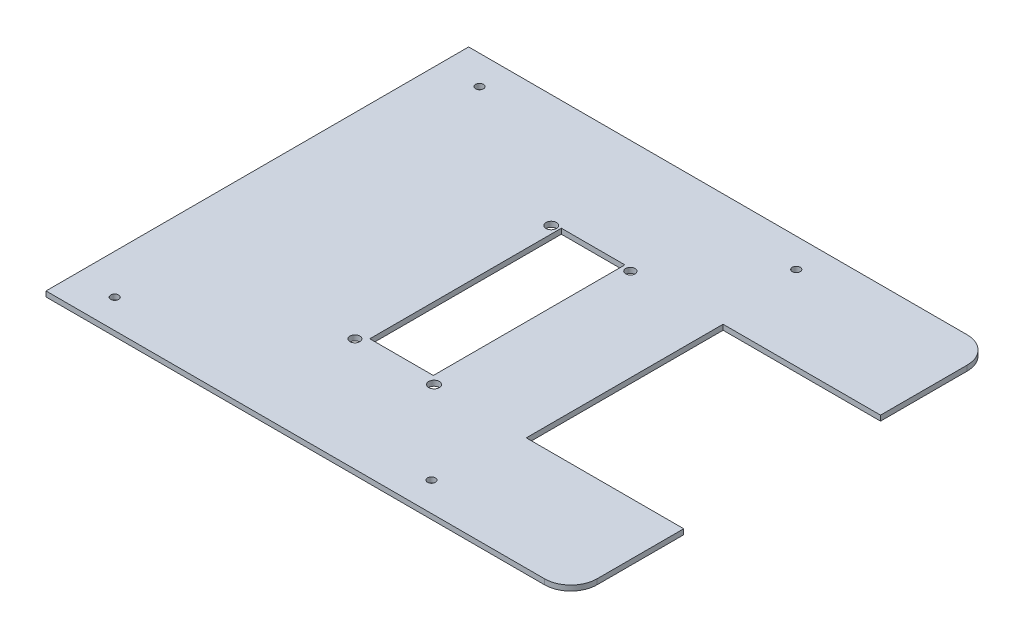
ISO-10303-21;
HEADER;
FILE_DESCRIPTION(('STEP AP214'),'2;1');
FILE_NAME('part.step','',(''),(''),'','','');
FILE_SCHEMA(('AUTOMOTIVE_DESIGN { 1 0 10303 214 1 1 1 1 }'));
ENDSEC;
DATA;
#1=APPLICATION_CONTEXT('core data for automotive mechanical design processes');
#2=APPLICATION_PROTOCOL_DEFINITION('international standard','automotive_design',2000,#1);
#3=PRODUCT_CONTEXT('',#1,'mechanical');
#4=PRODUCT('Part','Part','',(#3));
#5=PRODUCT_RELATED_PRODUCT_CATEGORY('part','',(#4));
#6=PRODUCT_DEFINITION_FORMATION('','',#4);
#7=PRODUCT_DEFINITION_CONTEXT('part definition',#1,'design');
#8=PRODUCT_DEFINITION('design','',#6,#7);
#9=PRODUCT_DEFINITION_SHAPE('','',#8);
#10=(LENGTH_UNIT() NAMED_UNIT(*) SI_UNIT(.MILLI.,.METRE.));
#11=(NAMED_UNIT(*) PLANE_ANGLE_UNIT() SI_UNIT($,.RADIAN.));
#12=(NAMED_UNIT(*) SI_UNIT($,.STERADIAN.) SOLID_ANGLE_UNIT());
#13=UNCERTAINTY_MEASURE_WITH_UNIT(LENGTH_MEASURE(1.E-05),#10,'distance_accuracy_value','');
#14=(GEOMETRIC_REPRESENTATION_CONTEXT(3) GLOBAL_UNCERTAINTY_ASSIGNED_CONTEXT((#13)) GLOBAL_UNIT_ASSIGNED_CONTEXT((#10,
#11,#12)) REPRESENTATION_CONTEXT('',''));
#15=CARTESIAN_POINT('',(0.,0.,0.));
#16=DIRECTION('',(0.,0.,1.));
#17=DIRECTION('',(1.,0.,0.));
#18=AXIS2_PLACEMENT_3D('',#15,#16,#17);
#19=CARTESIAN_POINT('',(-137.5,2.,80.53));
#20=DIRECTION('',(0.,0.,-1.));
#21=DIRECTION('',(-1.,0.,0.));
#22=AXIS2_PLACEMENT_3D('',#19,#20,#21);
#23=PLANE('',#22);
#24=DIRECTION('',(1.,0.,0.));
#25=VECTOR('',#24,1.);
#26=CARTESIAN_POINT('',(-137.5,0.,80.53));
#27=LINE('',#26,#25);
#28=CARTESIAN_POINT('',(-137.5,0.,80.53));
#29=VERTEX_POINT('',#28);
#30=CARTESIAN_POINT('',(52.5,0.,80.53));
#31=VERTEX_POINT('',#30);
#32=EDGE_CURVE('E207',#29,#31,#27,.T.);
#33=ORIENTED_EDGE('',*,*,#32,.T.);
#34=DIRECTION('',(0.,-1.,0.));
#35=VECTOR('',#34,1.);
#36=CARTESIAN_POINT('',(52.5,2.,80.53));
#37=LINE('',#36,#35);
#38=CARTESIAN_POINT('',(52.5,2.,80.53));
#39=VERTEX_POINT('',#38);
#40=EDGE_CURVE('E11',#31,#39,#37,.F.);
#41=ORIENTED_EDGE('',*,*,#40,.T.);
#42=DIRECTION('',(1.,0.,0.));
#43=VECTOR('',#42,1.);
#44=CARTESIAN_POINT('',(-137.5,2.,80.53));
#45=LINE('',#44,#43);
#46=CARTESIAN_POINT('',(-137.5,2.,80.53));
#47=VERTEX_POINT('',#46);
#48=EDGE_CURVE('E208',#47,#39,#45,.T.);
#49=ORIENTED_EDGE('',*,*,#48,.F.);
#50=DIRECTION('',(0.,-1.,0.));
#51=VECTOR('',#50,1.);
#52=CARTESIAN_POINT('',(-137.5,2.,80.53));
#53=LINE('',#52,#51);
#54=EDGE_CURVE('E226',#47,#29,#53,.T.);
#55=ORIENTED_EDGE('',*,*,#54,.T.);
#56=EDGE_LOOP('',(#33,#41,#49,#55));
#57=FACE_BOUND('',#56,.T.);
#58=ADVANCED_FACE('F34',(#57),#23,.F.);
#59=CARTESIAN_POINT('',(62.5,2.,37.5));
#60=DIRECTION('',(-1.,0.,0.));
#61=DIRECTION('',(0.,0.,1.));
#62=AXIS2_PLACEMENT_3D('',#59,#60,#61);
#63=PLANE('',#62);
#64=DIRECTION('',(0.,0.,-1.));
#65=VECTOR('',#64,1.);
#66=CARTESIAN_POINT('',(62.5,2.,37.5));
#67=LINE('',#66,#65);
#68=CARTESIAN_POINT('',(62.5,2.,70.53));
#69=VERTEX_POINT('',#68);
#70=CARTESIAN_POINT('',(62.5,2.,37.5));
#71=VERTEX_POINT('',#70);
#72=EDGE_CURVE('E210',#69,#71,#67,.T.);
#73=ORIENTED_EDGE('',*,*,#72,.F.);
#74=DIRECTION('',(0.,-1.,0.));
#75=VECTOR('',#74,1.);
#76=CARTESIAN_POINT('',(62.5,2.,70.53));
#77=LINE('',#76,#75);
#78=CARTESIAN_POINT('',(62.5,0.,70.53));
#79=VERTEX_POINT('',#78);
#80=EDGE_CURVE('E42',#69,#79,#77,.T.);
#81=ORIENTED_EDGE('',*,*,#80,.T.);
#82=DIRECTION('',(0.,0.,-1.));
#83=VECTOR('',#82,1.);
#84=CARTESIAN_POINT('',(62.5,0.,37.5));
#85=LINE('',#84,#83);
#86=CARTESIAN_POINT('',(62.5,0.,37.5));
#87=VERTEX_POINT('',#86);
#88=EDGE_CURVE('E228',#79,#87,#85,.T.);
#89=ORIENTED_EDGE('',*,*,#88,.T.);
#90=DIRECTION('',(0.,-1.,0.));
#91=VECTOR('',#90,1.);
#92=CARTESIAN_POINT('',(62.5,2.,37.5));
#93=LINE('',#92,#91);
#94=EDGE_CURVE('E256',#71,#87,#93,.T.);
#95=ORIENTED_EDGE('',*,*,#94,.F.);
#96=EDGE_LOOP('',(#73,#81,#89,#95));
#97=FACE_BOUND('',#96,.T.);
#98=ADVANCED_FACE('F274',(#97),#63,.F.);
#99=CARTESIAN_POINT('',(2.50000000000001,2.,37.5));
#100=DIRECTION('',(0.,0.,1.));
#101=DIRECTION('',(1.,0.,0.));
#102=AXIS2_PLACEMENT_3D('',#99,#100,#101);
#103=PLANE('',#102);
#104=DIRECTION('',(-1.,0.,0.));
#105=VECTOR('',#104,1.);
#106=CARTESIAN_POINT('',(2.50000000000001,0.,37.5));
#107=LINE('',#106,#105);
#108=CARTESIAN_POINT('',(2.50000000000001,0.,37.5));
#109=VERTEX_POINT('',#108);
#110=EDGE_CURVE('E230',#87,#109,#107,.T.);
#111=ORIENTED_EDGE('',*,*,#110,.T.);
#112=DIRECTION('',(0.,-1.,0.));
#113=VECTOR('',#112,1.);
#114=CARTESIAN_POINT('',(2.50000000000001,2.,37.5));
#115=LINE('',#114,#113);
#116=CARTESIAN_POINT('',(2.50000000000001,2.,37.5));
#117=VERTEX_POINT('',#116);
#118=EDGE_CURVE('E253',#117,#109,#115,.T.);
#119=ORIENTED_EDGE('',*,*,#118,.F.);
#120=DIRECTION('',(-1.,0.,0.));
#121=VECTOR('',#120,1.);
#122=CARTESIAN_POINT('',(2.50000000000001,2.,37.5));
#123=LINE('',#122,#121);
#124=EDGE_CURVE('E213',#71,#117,#123,.T.);
#125=ORIENTED_EDGE('',*,*,#124,.F.);
#126=ORIENTED_EDGE('',*,*,#94,.T.);
#127=EDGE_LOOP('',(#111,#119,#125,#126));
#128=FACE_BOUND('',#127,.T.);
#129=ADVANCED_FACE('F285',(#128),#103,.F.);
#130=CARTESIAN_POINT('',(2.5,2.,-37.5));
#131=DIRECTION('',(-1.,0.,0.));
#132=DIRECTION('',(0.,0.,1.));
#133=AXIS2_PLACEMENT_3D('',#130,#131,#132);
#134=PLANE('',#133);
#135=DIRECTION('',(0.,0.,-1.));
#136=VECTOR('',#135,1.);
#137=CARTESIAN_POINT('',(2.5,0.,-37.5));
#138=LINE('',#137,#136);
#139=CARTESIAN_POINT('',(2.5,0.,-37.5));
#140=VERTEX_POINT('',#139);
#141=EDGE_CURVE('E232',#109,#140,#138,.T.);
#142=ORIENTED_EDGE('',*,*,#141,.T.);
#143=DIRECTION('',(0.,-1.,0.));
#144=VECTOR('',#143,1.);
#145=CARTESIAN_POINT('',(2.5,2.,-37.5));
#146=LINE('',#145,#144);
#147=CARTESIAN_POINT('',(2.5,2.,-37.5));
#148=VERTEX_POINT('',#147);
#149=EDGE_CURVE('E250',#148,#140,#146,.T.);
#150=ORIENTED_EDGE('',*,*,#149,.F.);
#151=DIRECTION('',(0.,0.,-1.));
#152=VECTOR('',#151,1.);
#153=CARTESIAN_POINT('',(2.5,2.,-37.5));
#154=LINE('',#153,#152);
#155=EDGE_CURVE('E215',#117,#148,#154,.T.);
#156=ORIENTED_EDGE('',*,*,#155,.F.);
#157=ORIENTED_EDGE('',*,*,#118,.T.);
#158=EDGE_LOOP('',(#142,#150,#156,#157));
#159=FACE_BOUND('',#158,.T.);
#160=ADVANCED_FACE('F289',(#159),#134,.F.);
#161=CARTESIAN_POINT('',(2.5,2.,-37.5));
#162=DIRECTION('',(0.,0.,-1.));
#163=DIRECTION('',(-1.,0.,0.));
#164=AXIS2_PLACEMENT_3D('',#161,#162,#163);
#165=PLANE('',#164);
#166=DIRECTION('',(1.,0.,0.));
#167=VECTOR('',#166,1.);
#168=CARTESIAN_POINT('',(2.5,0.,-37.5));
#169=LINE('',#168,#167);
#170=CARTESIAN_POINT('',(62.5,0.,-37.5));
#171=VERTEX_POINT('',#170);
#172=EDGE_CURVE('E234',#140,#171,#169,.T.);
#173=ORIENTED_EDGE('',*,*,#172,.T.);
#174=DIRECTION('',(0.,-1.,0.));
#175=VECTOR('',#174,1.);
#176=CARTESIAN_POINT('',(62.5,2.,-37.5));
#177=LINE('',#176,#175);
#178=CARTESIAN_POINT('',(62.5,2.,-37.5));
#179=VERTEX_POINT('',#178);
#180=EDGE_CURVE('E247',#179,#171,#177,.T.);
#181=ORIENTED_EDGE('',*,*,#180,.F.);
#182=DIRECTION('',(1.,0.,0.));
#183=VECTOR('',#182,1.);
#184=CARTESIAN_POINT('',(2.5,2.,-37.5));
#185=LINE('',#184,#183);
#186=EDGE_CURVE('E217',#148,#179,#185,.T.);
#187=ORIENTED_EDGE('',*,*,#186,.F.);
#188=ORIENTED_EDGE('',*,*,#149,.T.);
#189=EDGE_LOOP('',(#173,#181,#187,#188));
#190=FACE_BOUND('',#189,.T.);
#191=ADVANCED_FACE('F297',(#190),#165,.F.);
#192=CARTESIAN_POINT('',(62.5,2.,-80.53));
#193=DIRECTION('',(-1.,0.,0.));
#194=DIRECTION('',(0.,0.,1.));
#195=AXIS2_PLACEMENT_3D('',#192,#193,#194);
#196=PLANE('',#195);
#197=DIRECTION('',(0.,0.,-1.));
#198=VECTOR('',#197,1.);
#199=CARTESIAN_POINT('',(62.5,0.,-80.53));
#200=LINE('',#199,#198);
#201=CARTESIAN_POINT('',(62.5,0.,-70.53));
#202=VERTEX_POINT('',#201);
#203=EDGE_CURVE('E236',#171,#202,#200,.T.);
#204=ORIENTED_EDGE('',*,*,#203,.T.);
#205=DIRECTION('',(0.,-1.,0.));
#206=VECTOR('',#205,1.);
#207=CARTESIAN_POINT('',(62.5,2.,-70.53));
#208=LINE('',#207,#206);
#209=CARTESIAN_POINT('',(62.5,2.,-70.53));
#210=VERTEX_POINT('',#209);
#211=EDGE_CURVE('E266',#202,#210,#208,.F.);
#212=ORIENTED_EDGE('',*,*,#211,.T.);
#213=DIRECTION('',(0.,0.,-1.));
#214=VECTOR('',#213,1.);
#215=CARTESIAN_POINT('',(62.5,2.,-80.53));
#216=LINE('',#215,#214);
#217=EDGE_CURVE('E219',#179,#210,#216,.T.);
#218=ORIENTED_EDGE('',*,*,#217,.F.);
#219=ORIENTED_EDGE('',*,*,#180,.T.);
#220=EDGE_LOOP('',(#204,#212,#218,#219));
#221=FACE_BOUND('',#220,.T.);
#222=ADVANCED_FACE('F300',(#221),#196,.F.);
#223=CARTESIAN_POINT('',(-137.5,2.,-80.53));
#224=DIRECTION('',(0.,0.,1.));
#225=DIRECTION('',(1.,0.,0.));
#226=AXIS2_PLACEMENT_3D('',#223,#224,#225);
#227=PLANE('',#226);
#228=DIRECTION('',(-1.,0.,0.));
#229=VECTOR('',#228,1.);
#230=CARTESIAN_POINT('',(-137.5,2.,-80.53));
#231=LINE('',#230,#229);
#232=CARTESIAN_POINT('',(52.5,2.,-80.53));
#233=VERTEX_POINT('',#232);
#234=CARTESIAN_POINT('',(-137.5,2.,-80.53));
#235=VERTEX_POINT('',#234);
#236=EDGE_CURVE('E222',#233,#235,#231,.T.);
#237=ORIENTED_EDGE('',*,*,#236,.F.);
#238=DIRECTION('',(0.,-1.,0.));
#239=VECTOR('',#238,1.);
#240=CARTESIAN_POINT('',(52.5,2.,-80.53));
#241=LINE('',#240,#239);
#242=CARTESIAN_POINT('',(52.5,0.,-80.53));
#243=VERTEX_POINT('',#242);
#244=EDGE_CURVE('E259',#233,#243,#241,.T.);
#245=ORIENTED_EDGE('',*,*,#244,.T.);
#246=DIRECTION('',(-1.,0.,0.));
#247=VECTOR('',#246,1.);
#248=CARTESIAN_POINT('',(-137.5,0.,-80.53));
#249=LINE('',#248,#247);
#250=CARTESIAN_POINT('',(-137.5,0.,-80.53));
#251=VERTEX_POINT('',#250);
#252=EDGE_CURVE('E239',#243,#251,#249,.T.);
#253=ORIENTED_EDGE('',*,*,#252,.T.);
#254=DIRECTION('',(0.,-1.,0.));
#255=VECTOR('',#254,1.);
#256=CARTESIAN_POINT('',(-137.5,2.,-80.53));
#257=LINE('',#256,#255);
#258=EDGE_CURVE('E244',#235,#251,#257,.T.);
#259=ORIENTED_EDGE('',*,*,#258,.F.);
#260=EDGE_LOOP('',(#237,#245,#253,#259));
#261=FACE_BOUND('',#260,.T.);
#262=ADVANCED_FACE('F308',(#261),#227,.F.);
#263=CARTESIAN_POINT('',(-137.5,2.,-80.53));
#264=DIRECTION('',(1.,0.,0.));
#265=DIRECTION('',(0.,0.,-1.));
#266=AXIS2_PLACEMENT_3D('',#263,#264,#265);
#267=PLANE('',#266);
#268=DIRECTION('',(0.,0.,1.));
#269=VECTOR('',#268,1.);
#270=CARTESIAN_POINT('',(-137.5,0.,-80.53));
#271=LINE('',#270,#269);
#272=EDGE_CURVE('E211',#251,#29,#271,.T.);
#273=ORIENTED_EDGE('',*,*,#272,.T.);
#274=ORIENTED_EDGE('',*,*,#54,.F.);
#275=DIRECTION('',(0.,0.,1.));
#276=VECTOR('',#275,1.);
#277=CARTESIAN_POINT('',(-137.5,2.,-80.53));
#278=LINE('',#277,#276);
#279=EDGE_CURVE('E224',#235,#47,#278,.T.);
#280=ORIENTED_EDGE('',*,*,#279,.F.);
#281=ORIENTED_EDGE('',*,*,#258,.T.);
#282=EDGE_LOOP('',(#273,#274,#280,#281));
#283=FACE_BOUND('',#282,.T.);
#284=ADVANCED_FACE('F313',(#283),#267,.F.);
#285=CARTESIAN_POINT('',(0.,2.,0.));
#286=DIRECTION('',(0.,-1.,0.));
#287=DIRECTION('',(0.,0.,-1.));
#288=AXIS2_PLACEMENT_3D('',#285,#286,#287);
#289=PLANE('',#288);
#290=DIRECTION('',(0.,0.,-1.));
#291=VECTOR('',#290,1.);
#292=CARTESIAN_POINT('',(-35.7971371461386,2.,34.6246085192166));
#293=LINE('',#292,#291);
#294=CARTESIAN_POINT('',(-35.7971371461386,2.,34.6246085192166));
#295=VERTEX_POINT('',#294);
#296=CARTESIAN_POINT('',(-35.7971371461386,2.,-38.3753914807834));
#297=VERTEX_POINT('',#296);
#298=EDGE_CURVE('E160',#295,#297,#293,.T.);
#299=ORIENTED_EDGE('',*,*,#298,.F.);
#300=DIRECTION('',(1.,0.,0.));
#301=VECTOR('',#300,1.);
#302=CARTESIAN_POINT('',(-60.009650866527,2.,34.6246085192166));
#303=LINE('',#302,#301);
#304=CARTESIAN_POINT('',(-60.009650866527,2.,34.6246085192166));
#305=VERTEX_POINT('',#304);
#306=EDGE_CURVE('E152',#305,#295,#303,.T.);
#307=ORIENTED_EDGE('',*,*,#306,.F.);
#308=DIRECTION('',(0.,0.,1.));
#309=VECTOR('',#308,1.);
#310=CARTESIAN_POINT('',(-60.009650866527,2.,34.6246085192166));
#311=LINE('',#310,#309);
#312=CARTESIAN_POINT('',(-60.009650866527,2.,-38.3753914807834));
#313=VERTEX_POINT('',#312);
#314=EDGE_CURVE('E164',#313,#305,#311,.T.);
#315=ORIENTED_EDGE('',*,*,#314,.F.);
#316=DIRECTION('',(-1.,0.,0.));
#317=VECTOR('',#316,1.);
#318=CARTESIAN_POINT('',(-60.009650866527,2.,-38.3753914807834));
#319=LINE('',#318,#317);
#320=EDGE_CURVE('E158',#297,#313,#319,.T.);
#321=ORIENTED_EDGE('',*,*,#320,.F.);
#322=EDGE_LOOP('',(#299,#307,#315,#321));
#323=FACE_BOUND('',#322,.T.);
#324=CARTESIAN_POINT('',(-32.6708403779295,2.,37.4776752133358));
#325=DIRECTION('',(0.,1.,0.));
#326=DIRECTION('',(0.,0.,1.));
#327=AXIS2_PLACEMENT_3D('',#324,#325,#326);
#328=CIRCLE('',#327,2.03091857967747);
#329=CARTESIAN_POINT('',(-32.6708403779295,2.,39.5085937930132));
#330=VERTEX_POINT('',#329);
#331=EDGE_CURVE('E175',#330,#330,#328,.T.);
#332=ORIENTED_EDGE('',*,*,#331,.F.);
#333=EDGE_LOOP('',(#332));
#334=FACE_BOUND('',#333,.T.);
#335=CARTESIAN_POINT('',(-62.825802134075,2.,37.4776752133358));
#336=DIRECTION('',(0.,1.,0.));
#337=DIRECTION('',(0.,0.,1.));
#338=AXIS2_PLACEMENT_3D('',#335,#336,#337);
#339=CIRCLE('',#338,1.87743327859517);
#340=CARTESIAN_POINT('',(-62.825802134075,2.,39.3551084919309));
#341=VERTEX_POINT('',#340);
#342=EDGE_CURVE('E398',#341,#341,#339,.T.);
#343=ORIENTED_EDGE('',*,*,#342,.F.);
#344=EDGE_LOOP('',(#343));
#345=FACE_BOUND('',#344,.T.);
#346=CARTESIAN_POINT('',(-62.825802134075,2.,-37.3317814129602));
#347=DIRECTION('',(0.,1.,0.));
#348=DIRECTION('',(0.,0.,1.));
#349=AXIS2_PLACEMENT_3D('',#346,#347,#348);
#350=CIRCLE('',#349,1.9941902111433);
#351=CARTESIAN_POINT('',(-62.825802134075,2.,-35.3375912018169));
#352=VERTEX_POINT('',#351);
#353=EDGE_CURVE('E390',#352,#352,#350,.T.);
#354=ORIENTED_EDGE('',*,*,#353,.F.);
#355=EDGE_LOOP('',(#354));
#356=FACE_BOUND('',#355,.T.);
#357=CARTESIAN_POINT('',(-1.62345605553164,2.,69.5158266117069));
#358=DIRECTION('',(0.,1.,0.));
#359=DIRECTION('',(0.,0.,1.));
#360=AXIS2_PLACEMENT_3D('',#357,#358,#359);
#361=CIRCLE('',#360,1.5);
#362=CARTESIAN_POINT('',(-1.62345605553164,2.,71.0158266117069));
#363=VERTEX_POINT('',#362);
#364=EDGE_CURVE('E190',#363,#363,#361,.T.);
#365=ORIENTED_EDGE('',*,*,#364,.F.);
#366=EDGE_LOOP('',(#365));
#367=FACE_BOUND('',#366,.T.);
#368=CARTESIAN_POINT('',(-122.33249234366,2.,-69.5158266117069));
#369=DIRECTION('',(0.,1.,0.));
#370=DIRECTION('',(0.,0.,-1.));
#371=AXIS2_PLACEMENT_3D('',#368,#369,#370);
#372=CIRCLE('',#371,1.5);
#373=CARTESIAN_POINT('',(-122.33249234366,2.,-71.0158266117069));
#374=VERTEX_POINT('',#373);
#375=EDGE_CURVE('E183',#374,#374,#372,.T.);
#376=ORIENTED_EDGE('',*,*,#375,.F.);
#377=EDGE_LOOP('',(#376));
#378=FACE_BOUND('',#377,.T.);
#379=CARTESIAN_POINT('',(-1.62345605553164,2.,-69.5158266117069));
#380=DIRECTION('',(0.,1.,0.));
#381=DIRECTION('',(0.,0.,-1.));
#382=AXIS2_PLACEMENT_3D('',#379,#380,#381);
#383=CIRCLE('',#382,1.5);
#384=CARTESIAN_POINT('',(-1.62345605553164,2.,-71.0158266117069));
#385=VERTEX_POINT('',#384);
#386=EDGE_CURVE('E176',#385,#385,#383,.T.);
#387=ORIENTED_EDGE('',*,*,#386,.F.);
#388=EDGE_LOOP('',(#387));
#389=FACE_BOUND('',#388,.T.);
#390=CARTESIAN_POINT('',(-32.6708403779295,2.,-37.3317814129602));
#391=DIRECTION('',(0.,1.,0.));
#392=DIRECTION('',(0.,0.,1.));
#393=AXIS2_PLACEMENT_3D('',#390,#391,#392);
#394=CIRCLE('',#393,1.79276680255423);
#395=CARTESIAN_POINT('',(-32.6708403779295,2.,-35.539014610406));
#396=VERTEX_POINT('',#395);
#397=EDGE_CURVE('E184',#396,#396,#394,.T.);
#398=ORIENTED_EDGE('',*,*,#397,.F.);
#399=EDGE_LOOP('',(#398));
#400=FACE_BOUND('',#399,.T.);
#401=CARTESIAN_POINT('',(-122.33249234366,2.,69.5158266117069));
#402=DIRECTION('',(0.,1.,0.));
#403=DIRECTION('',(0.,0.,1.));
#404=AXIS2_PLACEMENT_3D('',#401,#402,#403);
#405=CIRCLE('',#404,1.5);
#406=CARTESIAN_POINT('',(-122.33249234366,2.,71.0158266117069));
#407=VERTEX_POINT('',#406);
#408=EDGE_CURVE('E197',#407,#407,#405,.T.);
#409=ORIENTED_EDGE('',*,*,#408,.F.);
#410=EDGE_LOOP('',(#409));
#411=FACE_BOUND('',#410,.T.);
#412=ORIENTED_EDGE('',*,*,#217,.T.);
#413=CARTESIAN_POINT('',(52.5,2.,-70.53));
#414=DIRECTION('',(0.,-1.,0.));
#415=DIRECTION('',(0.,0.,-1.));
#416=AXIS2_PLACEMENT_3D('',#413,#414,#415);
#417=CIRCLE('',#416,10.);
#418=EDGE_CURVE('E269',#210,#233,#417,.F.);
#419=ORIENTED_EDGE('',*,*,#418,.T.);
#420=ORIENTED_EDGE('',*,*,#236,.T.);
#421=ORIENTED_EDGE('',*,*,#279,.T.);
#422=ORIENTED_EDGE('',*,*,#48,.T.);
#423=CARTESIAN_POINT('',(52.5,2.,70.53));
#424=DIRECTION('',(0.,-1.,0.));
#425=DIRECTION('',(0.,0.,-1.));
#426=AXIS2_PLACEMENT_3D('',#423,#424,#425);
#427=CIRCLE('',#426,10.);
#428=EDGE_CURVE('E49',#39,#69,#427,.F.);
#429=ORIENTED_EDGE('',*,*,#428,.T.);
#430=ORIENTED_EDGE('',*,*,#72,.T.);
#431=ORIENTED_EDGE('',*,*,#124,.T.);
#432=ORIENTED_EDGE('',*,*,#155,.T.);
#433=ORIENTED_EDGE('',*,*,#186,.T.);
#434=EDGE_LOOP('',(#412,#419,#420,#421,#422,#429,#430,#431,#432,#433));
#435=FACE_BOUND('',#434,.T.);
#436=ADVANCED_FACE('F292',(#323,#334,#345,#356,#367,#378,#389,#400,#411,#435),#289,.F.);
#437=CARTESIAN_POINT('',(0.,0.,0.));
#438=DIRECTION('',(0.,-1.,0.));
#439=DIRECTION('',(0.,0.,-1.));
#440=AXIS2_PLACEMENT_3D('',#437,#438,#439);
#441=PLANE('',#440);
#442=DIRECTION('',(1.,0.,0.));
#443=VECTOR('',#442,1.);
#444=CARTESIAN_POINT('',(-60.009650866527,0.,34.6246085192166));
#445=LINE('',#444,#443);
#446=CARTESIAN_POINT('',(-60.009650866527,0.,34.6246085192166));
#447=VERTEX_POINT('',#446);
#448=CARTESIAN_POINT('',(-35.7971371461386,0.,34.6246085192166));
#449=VERTEX_POINT('',#448);
#450=EDGE_CURVE('E149',#447,#449,#445,.T.);
#451=ORIENTED_EDGE('',*,*,#450,.T.);
#452=DIRECTION('',(0.,0.,-1.));
#453=VECTOR('',#452,1.);
#454=CARTESIAN_POINT('',(-35.7971371461386,0.,34.6246085192166));
#455=LINE('',#454,#453);
#456=CARTESIAN_POINT('',(-35.7971371461386,0.,-38.3753914807834));
#457=VERTEX_POINT('',#456);
#458=EDGE_CURVE('E135',#449,#457,#455,.T.);
#459=ORIENTED_EDGE('',*,*,#458,.T.);
#460=DIRECTION('',(-1.,0.,0.));
#461=VECTOR('',#460,1.);
#462=CARTESIAN_POINT('',(-60.009650866527,0.,-38.3753914807834));
#463=LINE('',#462,#461);
#464=CARTESIAN_POINT('',(-60.009650866527,0.,-38.3753914807834));
#465=VERTEX_POINT('',#464);
#466=EDGE_CURVE('E169',#457,#465,#463,.T.);
#467=ORIENTED_EDGE('',*,*,#466,.T.);
#468=DIRECTION('',(0.,0.,1.));
#469=VECTOR('',#468,1.);
#470=CARTESIAN_POINT('',(-60.009650866527,0.,34.6246085192166));
#471=LINE('',#470,#469);
#472=EDGE_CURVE('E157',#465,#447,#471,.T.);
#473=ORIENTED_EDGE('',*,*,#472,.T.);
#474=EDGE_LOOP('',(#451,#459,#467,#473));
#475=FACE_BOUND('',#474,.T.);
#476=CARTESIAN_POINT('',(-32.6708403779295,0.,37.4776752133358));
#477=DIRECTION('',(0.,-1.,0.));
#478=DIRECTION('',(0.,0.,-1.));
#479=AXIS2_PLACEMENT_3D('',#476,#477,#478);
#480=CIRCLE('',#479,2.03091857967747);
#481=CARTESIAN_POINT('',(-32.6708403779295,0.,35.4467566336583));
#482=VERTEX_POINT('',#481);
#483=EDGE_CURVE('E401',#482,#482,#480,.F.);
#484=ORIENTED_EDGE('',*,*,#483,.T.);
#485=EDGE_LOOP('',(#484));
#486=FACE_BOUND('',#485,.T.);
#487=CARTESIAN_POINT('',(-62.825802134075,0.,37.4776752133358));
#488=DIRECTION('',(0.,-1.,0.));
#489=DIRECTION('',(0.,0.,-1.));
#490=AXIS2_PLACEMENT_3D('',#487,#488,#489);
#491=CIRCLE('',#490,1.87743327859517);
#492=CARTESIAN_POINT('',(-62.825802134075,0.,35.6002419347406));
#493=VERTEX_POINT('',#492);
#494=EDGE_CURVE('E395',#493,#493,#491,.F.);
#495=ORIENTED_EDGE('',*,*,#494,.T.);
#496=EDGE_LOOP('',(#495));
#497=FACE_BOUND('',#496,.T.);
#498=CARTESIAN_POINT('',(-62.825802134075,0.,-37.3317814129602));
#499=DIRECTION('',(0.,-1.,0.));
#500=DIRECTION('',(0.,0.,-1.));
#501=AXIS2_PLACEMENT_3D('',#498,#499,#500);
#502=CIRCLE('',#501,1.9941902111433);
#503=CARTESIAN_POINT('',(-62.825802134075,0.,-39.3259716241035));
#504=VERTEX_POINT('',#503);
#505=EDGE_CURVE('E187',#504,#504,#502,.F.);
#506=ORIENTED_EDGE('',*,*,#505,.T.);
#507=EDGE_LOOP('',(#506));
#508=FACE_BOUND('',#507,.T.);
#509=CARTESIAN_POINT('',(-1.62345605553164,0.,69.5158266117069));
#510=DIRECTION('',(0.,-1.,0.));
#511=DIRECTION('',(0.,0.,-1.));
#512=AXIS2_PLACEMENT_3D('',#509,#510,#511);
#513=CIRCLE('',#512,1.5);
#514=CARTESIAN_POINT('',(-1.62345605553164,0.,68.0158266117069));
#515=VERTEX_POINT('',#514);
#516=EDGE_CURVE('E193',#515,#515,#513,.F.);
#517=ORIENTED_EDGE('',*,*,#516,.T.);
#518=EDGE_LOOP('',(#517));
#519=FACE_BOUND('',#518,.T.);
#520=CARTESIAN_POINT('',(-122.33249234366,0.,-69.5158266117069));
#521=DIRECTION('',(0.,-1.,0.));
#522=DIRECTION('',(0.,0.,-1.));
#523=AXIS2_PLACEMENT_3D('',#520,#521,#522);
#524=CIRCLE('',#523,1.5);
#525=CARTESIAN_POINT('',(-122.33249234366,0.,-71.0158266117069));
#526=VERTEX_POINT('',#525);
#527=EDGE_CURVE('E194',#526,#526,#524,.F.);
#528=ORIENTED_EDGE('',*,*,#527,.T.);
#529=EDGE_LOOP('',(#528));
#530=FACE_BOUND('',#529,.T.);
#531=CARTESIAN_POINT('',(-1.62345605553164,0.,-69.5158266117069));
#532=DIRECTION('',(0.,-1.,0.));
#533=DIRECTION('',(0.,0.,-1.));
#534=AXIS2_PLACEMENT_3D('',#531,#532,#533);
#535=CIRCLE('',#534,1.5);
#536=CARTESIAN_POINT('',(-1.62345605553164,0.,-71.0158266117069));
#537=VERTEX_POINT('',#536);
#538=EDGE_CURVE('E179',#537,#537,#535,.F.);
#539=ORIENTED_EDGE('',*,*,#538,.T.);
#540=EDGE_LOOP('',(#539));
#541=FACE_BOUND('',#540,.T.);
#542=CARTESIAN_POINT('',(-32.6708403779295,0.,-37.3317814129602));
#543=DIRECTION('',(0.,-1.,0.));
#544=DIRECTION('',(0.,0.,-1.));
#545=AXIS2_PLACEMENT_3D('',#542,#543,#544);
#546=CIRCLE('',#545,1.79276680255423);
#547=CARTESIAN_POINT('',(-32.6708403779295,0.,-39.1245482155145));
#548=VERTEX_POINT('',#547);
#549=EDGE_CURVE('E180',#548,#548,#546,.F.);
#550=ORIENTED_EDGE('',*,*,#549,.T.);
#551=EDGE_LOOP('',(#550));
#552=FACE_BOUND('',#551,.T.);
#553=CARTESIAN_POINT('',(-122.33249234366,0.,69.5158266117069));
#554=DIRECTION('',(0.,-1.,0.));
#555=DIRECTION('',(0.,0.,-1.));
#556=AXIS2_PLACEMENT_3D('',#553,#554,#555);
#557=CIRCLE('',#556,1.5);
#558=CARTESIAN_POINT('',(-122.33249234366,0.,68.0158266117069));
#559=VERTEX_POINT('',#558);
#560=EDGE_CURVE('E204',#559,#559,#557,.F.);
#561=ORIENTED_EDGE('',*,*,#560,.T.);
#562=EDGE_LOOP('',(#561));
#563=FACE_BOUND('',#562,.T.);
#564=ORIENTED_EDGE('',*,*,#252,.F.);
#565=CARTESIAN_POINT('',(52.5,0.,-70.53));
#566=DIRECTION('',(0.,-1.,0.));
#567=DIRECTION('',(0.,0.,-1.));
#568=AXIS2_PLACEMENT_3D('',#565,#566,#567);
#569=CIRCLE('',#568,10.);
#570=EDGE_CURVE('E264',#243,#202,#569,.T.);
#571=ORIENTED_EDGE('',*,*,#570,.T.);
#572=ORIENTED_EDGE('',*,*,#203,.F.);
#573=ORIENTED_EDGE('',*,*,#172,.F.);
#574=ORIENTED_EDGE('',*,*,#141,.F.);
#575=ORIENTED_EDGE('',*,*,#110,.F.);
#576=ORIENTED_EDGE('',*,*,#88,.F.);
#577=CARTESIAN_POINT('',(52.5,0.,70.53));
#578=DIRECTION('',(0.,-1.,0.));
#579=DIRECTION('',(0.,0.,-1.));
#580=AXIS2_PLACEMENT_3D('',#577,#578,#579);
#581=CIRCLE('',#580,10.);
#582=EDGE_CURVE('E262',#79,#31,#581,.T.);
#583=ORIENTED_EDGE('',*,*,#582,.T.);
#584=ORIENTED_EDGE('',*,*,#32,.F.);
#585=ORIENTED_EDGE('',*,*,#272,.F.);
#586=EDGE_LOOP('',(#564,#571,#572,#573,#574,#575,#576,#583,#584,#585));
#587=FACE_BOUND('',#586,.T.);
#588=ADVANCED_FACE('F155',(#475,#486,#497,#508,#519,#530,#541,#552,#563,#587),#441,.T.);
#589=CARTESIAN_POINT('',(-122.33249234366,-76.9106352896658,69.5158266117069));
#590=DIRECTION('',(0.,1.,0.));
#591=DIRECTION('',(0.,0.,1.));
#592=AXIS2_PLACEMENT_3D('',#589,#590,#591);
#593=CYLINDRICAL_SURFACE('',#592,1.5);
#594=ORIENTED_EDGE('',*,*,#408,.T.);
#595=EDGE_LOOP('',(#594));
#596=FACE_BOUND('',#595,.T.);
#597=ORIENTED_EDGE('',*,*,#560,.F.);
#598=EDGE_LOOP('',(#597));
#599=FACE_BOUND('',#598,.T.);
#600=ADVANCED_FACE('F340',(#596,#599),#593,.F.);
#601=CARTESIAN_POINT('',(-32.6708403779295,-76.9106352896658,-37.3317814129602));
#602=DIRECTION('',(0.,1.,0.));
#603=DIRECTION('',(0.,0.,1.));
#604=AXIS2_PLACEMENT_3D('',#601,#602,#603);
#605=CYLINDRICAL_SURFACE('',#604,1.79276680255423);
#606=ORIENTED_EDGE('',*,*,#397,.T.);
#607=EDGE_LOOP('',(#606));
#608=FACE_BOUND('',#607,.T.);
#609=ORIENTED_EDGE('',*,*,#549,.F.);
#610=EDGE_LOOP('',(#609));
#611=FACE_BOUND('',#610,.T.);
#612=ADVANCED_FACE('F346',(#608,#611),#605,.F.);
#613=CARTESIAN_POINT('',(-1.62345605553164,-76.9106352896658,-69.5158266117069));
#614=DIRECTION('',(0.,1.,0.));
#615=DIRECTION('',(0.,0.,1.));
#616=AXIS2_PLACEMENT_3D('',#613,#614,#615);
#617=CYLINDRICAL_SURFACE('',#616,1.5);
#618=ORIENTED_EDGE('',*,*,#386,.T.);
#619=EDGE_LOOP('',(#618));
#620=FACE_BOUND('',#619,.T.);
#621=ORIENTED_EDGE('',*,*,#538,.F.);
#622=EDGE_LOOP('',(#621));
#623=FACE_BOUND('',#622,.T.);
#624=ADVANCED_FACE('F352',(#620,#623),#617,.F.);
#625=CARTESIAN_POINT('',(-122.33249234366,-76.9106352896658,-69.5158266117069));
#626=DIRECTION('',(0.,1.,0.));
#627=DIRECTION('',(0.,0.,1.));
#628=AXIS2_PLACEMENT_3D('',#625,#626,#627);
#629=CYLINDRICAL_SURFACE('',#628,1.5);
#630=ORIENTED_EDGE('',*,*,#375,.T.);
#631=EDGE_LOOP('',(#630));
#632=FACE_BOUND('',#631,.T.);
#633=ORIENTED_EDGE('',*,*,#527,.F.);
#634=EDGE_LOOP('',(#633));
#635=FACE_BOUND('',#634,.T.);
#636=ADVANCED_FACE('F348',(#632,#635),#629,.F.);
#637=CARTESIAN_POINT('',(-1.62345605553164,-76.9106352896658,69.5158266117069));
#638=DIRECTION('',(0.,1.,0.));
#639=DIRECTION('',(0.,0.,1.));
#640=AXIS2_PLACEMENT_3D('',#637,#638,#639);
#641=CYLINDRICAL_SURFACE('',#640,1.5);
#642=ORIENTED_EDGE('',*,*,#364,.T.);
#643=EDGE_LOOP('',(#642));
#644=FACE_BOUND('',#643,.T.);
#645=ORIENTED_EDGE('',*,*,#516,.F.);
#646=EDGE_LOOP('',(#645));
#647=FACE_BOUND('',#646,.T.);
#648=ADVANCED_FACE('F351',(#644,#647),#641,.F.);
#649=CARTESIAN_POINT('',(-62.825802134075,-76.9106352896658,-37.3317814129602));
#650=DIRECTION('',(0.,1.,0.));
#651=DIRECTION('',(0.,0.,1.));
#652=AXIS2_PLACEMENT_3D('',#649,#650,#651);
#653=CYLINDRICAL_SURFACE('',#652,1.9941902111433);
#654=ORIENTED_EDGE('',*,*,#353,.T.);
#655=EDGE_LOOP('',(#654));
#656=FACE_BOUND('',#655,.T.);
#657=ORIENTED_EDGE('',*,*,#505,.F.);
#658=EDGE_LOOP('',(#657));
#659=FACE_BOUND('',#658,.T.);
#660=ADVANCED_FACE('F356',(#656,#659),#653,.F.);
#661=CARTESIAN_POINT('',(-62.825802134075,-76.9106352896658,37.4776752133358));
#662=DIRECTION('',(0.,1.,0.));
#663=DIRECTION('',(0.,0.,1.));
#664=AXIS2_PLACEMENT_3D('',#661,#662,#663);
#665=CYLINDRICAL_SURFACE('',#664,1.87743327859517);
#666=ORIENTED_EDGE('',*,*,#342,.T.);
#667=EDGE_LOOP('',(#666));
#668=FACE_BOUND('',#667,.T.);
#669=ORIENTED_EDGE('',*,*,#494,.F.);
#670=EDGE_LOOP('',(#669));
#671=FACE_BOUND('',#670,.T.);
#672=ADVANCED_FACE('F378',(#668,#671),#665,.F.);
#673=CARTESIAN_POINT('',(-32.6708403779295,-76.9106352896658,37.4776752133358));
#674=DIRECTION('',(0.,1.,0.));
#675=DIRECTION('',(0.,0.,1.));
#676=AXIS2_PLACEMENT_3D('',#673,#674,#675);
#677=CYLINDRICAL_SURFACE('',#676,2.03091857967747);
#678=ORIENTED_EDGE('',*,*,#331,.T.);
#679=EDGE_LOOP('',(#678));
#680=FACE_BOUND('',#679,.T.);
#681=ORIENTED_EDGE('',*,*,#483,.F.);
#682=EDGE_LOOP('',(#681));
#683=FACE_BOUND('',#682,.T.);
#684=ADVANCED_FACE('F366',(#680,#683),#677,.F.);
#685=CARTESIAN_POINT('',(-60.009650866527,-76.9106352896658,34.6246085192166));
#686=DIRECTION('',(0.,0.,1.));
#687=DIRECTION('',(1.,0.,0.));
#688=AXIS2_PLACEMENT_3D('',#685,#686,#687);
#689=PLANE('',#688);
#690=DIRECTION('',(0.,1.,0.));
#691=VECTOR('',#690,1.);
#692=CARTESIAN_POINT('',(-60.009650866527,-76.9106352896658,34.6246085192166));
#693=LINE('',#692,#691);
#694=EDGE_CURVE('E167',#447,#305,#693,.T.);
#695=ORIENTED_EDGE('',*,*,#694,.T.);
#696=ORIENTED_EDGE('',*,*,#306,.T.);
#697=DIRECTION('',(0.,1.,0.));
#698=VECTOR('',#697,1.);
#699=CARTESIAN_POINT('',(-35.7971371461386,-76.9106352896658,34.6246085192166));
#700=LINE('',#699,#698);
#701=EDGE_CURVE('E139',#449,#295,#700,.T.);
#702=ORIENTED_EDGE('',*,*,#701,.F.);
#703=ORIENTED_EDGE('',*,*,#450,.F.);
#704=EDGE_LOOP('',(#695,#696,#702,#703));
#705=FACE_BOUND('',#704,.T.);
#706=ADVANCED_FACE('F148',(#705),#689,.F.);
#707=CARTESIAN_POINT('',(-35.7971371461386,-76.9106352896658,34.6246085192166));
#708=DIRECTION('',(1.,0.,0.));
#709=DIRECTION('',(0.,0.,-1.));
#710=AXIS2_PLACEMENT_3D('',#707,#708,#709);
#711=PLANE('',#710);
#712=ORIENTED_EDGE('',*,*,#701,.T.);
#713=ORIENTED_EDGE('',*,*,#298,.T.);
#714=DIRECTION('',(0.,1.,0.));
#715=VECTOR('',#714,1.);
#716=CARTESIAN_POINT('',(-35.7971371461386,-76.9106352896658,-38.3753914807834));
#717=LINE('',#716,#715);
#718=EDGE_CURVE('E141',#457,#297,#717,.T.);
#719=ORIENTED_EDGE('',*,*,#718,.F.);
#720=ORIENTED_EDGE('',*,*,#458,.F.);
#721=EDGE_LOOP('',(#712,#713,#719,#720));
#722=FACE_BOUND('',#721,.T.);
#723=ADVANCED_FACE('F137',(#722),#711,.F.);
#724=CARTESIAN_POINT('',(-60.009650866527,-76.9106352896658,-38.3753914807834));
#725=DIRECTION('',(0.,0.,-1.));
#726=DIRECTION('',(-1.,0.,0.));
#727=AXIS2_PLACEMENT_3D('',#724,#725,#726);
#728=PLANE('',#727);
#729=ORIENTED_EDGE('',*,*,#718,.T.);
#730=ORIENTED_EDGE('',*,*,#320,.T.);
#731=DIRECTION('',(0.,1.,0.));
#732=VECTOR('',#731,1.);
#733=CARTESIAN_POINT('',(-60.009650866527,-76.9106352896658,-38.3753914807834));
#734=LINE('',#733,#732);
#735=EDGE_CURVE('E168',#465,#313,#734,.T.);
#736=ORIENTED_EDGE('',*,*,#735,.F.);
#737=ORIENTED_EDGE('',*,*,#466,.F.);
#738=EDGE_LOOP('',(#729,#730,#736,#737));
#739=FACE_BOUND('',#738,.T.);
#740=ADVANCED_FACE('F369',(#739),#728,.F.);
#741=CARTESIAN_POINT('',(-60.009650866527,-76.9106352896658,34.6246085192166));
#742=DIRECTION('',(-1.,0.,0.));
#743=DIRECTION('',(0.,0.,1.));
#744=AXIS2_PLACEMENT_3D('',#741,#742,#743);
#745=PLANE('',#744);
#746=ORIENTED_EDGE('',*,*,#735,.T.);
#747=ORIENTED_EDGE('',*,*,#314,.T.);
#748=ORIENTED_EDGE('',*,*,#694,.F.);
#749=ORIENTED_EDGE('',*,*,#472,.F.);
#750=EDGE_LOOP('',(#746,#747,#748,#749));
#751=FACE_BOUND('',#750,.T.);
#752=ADVANCED_FACE('F318',(#751),#745,.F.);
#753=CARTESIAN_POINT('',(52.5,2.,-70.53));
#754=DIRECTION('',(0.,-1.,0.));
#755=DIRECTION('',(0.,0.,-1.));
#756=AXIS2_PLACEMENT_3D('',#753,#754,#755);
#757=CYLINDRICAL_SURFACE('',#756,10.);
#758=ORIENTED_EDGE('',*,*,#418,.F.);
#759=ORIENTED_EDGE('',*,*,#211,.F.);
#760=ORIENTED_EDGE('',*,*,#570,.F.);
#761=ORIENTED_EDGE('',*,*,#244,.F.);
#762=EDGE_LOOP('',(#758,#759,#760,#761));
#763=FACE_BOUND('',#762,.T.);
#764=ADVANCED_FACE('F303',(#763),#757,.T.);
#765=CARTESIAN_POINT('',(52.5,2.,70.53));
#766=DIRECTION('',(0.,-1.,0.));
#767=DIRECTION('',(0.,0.,-1.));
#768=AXIS2_PLACEMENT_3D('',#765,#766,#767);
#769=CYLINDRICAL_SURFACE('',#768,10.);
#770=ORIENTED_EDGE('',*,*,#428,.F.);
#771=ORIENTED_EDGE('',*,*,#40,.F.);
#772=ORIENTED_EDGE('',*,*,#582,.F.);
#773=ORIENTED_EDGE('',*,*,#80,.F.);
#774=EDGE_LOOP('',(#770,#771,#772,#773));
#775=FACE_BOUND('',#774,.T.);
#776=ADVANCED_FACE('F36',(#775),#769,.T.);
#777=CLOSED_SHELL('',(#58,#98,#129,#160,#191,#222,#262,#284,#436,#588,#600,#612,#624,#636,#648,
#660,#672,#684,#706,#723,#740,#752,#764,#776));
#778=MANIFOLD_SOLID_BREP('B2',#777);
#779=ADVANCED_BREP_SHAPE_REPRESENTATION('',(#18,#778),#14);
#780=SHAPE_DEFINITION_REPRESENTATION(#9,#779);
ENDSEC;
END-ISO-10303-21;
